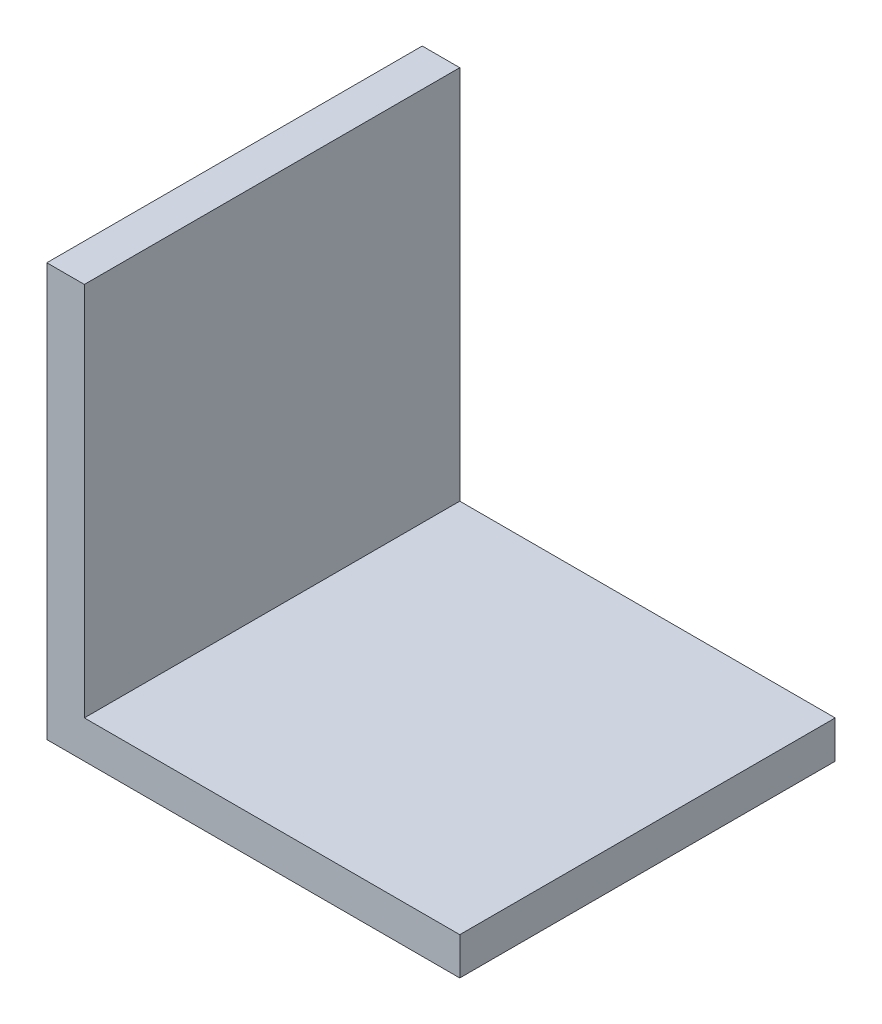
ISO-10303-21;
HEADER;
FILE_DESCRIPTION(('STEP AP214'),'2;1');
FILE_NAME('part.step','',(''),(''),'','','');
FILE_SCHEMA(('AUTOMOTIVE_DESIGN { 1 0 10303 214 1 1 1 1 }'));
ENDSEC;
DATA;
#1=APPLICATION_CONTEXT('core data for automotive mechanical design processes');
#2=APPLICATION_PROTOCOL_DEFINITION('international standard','automotive_design',2000,#1);
#3=PRODUCT_CONTEXT('',#1,'mechanical');
#4=PRODUCT('Part','Part','',(#3));
#5=PRODUCT_RELATED_PRODUCT_CATEGORY('part','',(#4));
#6=PRODUCT_DEFINITION_FORMATION('','',#4);
#7=PRODUCT_DEFINITION_CONTEXT('part definition',#1,'design');
#8=PRODUCT_DEFINITION('design','',#6,#7);
#9=PRODUCT_DEFINITION_SHAPE('','',#8);
#10=(LENGTH_UNIT() NAMED_UNIT(*) SI_UNIT(.MILLI.,.METRE.));
#11=(NAMED_UNIT(*) PLANE_ANGLE_UNIT() SI_UNIT($,.RADIAN.));
#12=(NAMED_UNIT(*) SI_UNIT($,.STERADIAN.) SOLID_ANGLE_UNIT());
#13=UNCERTAINTY_MEASURE_WITH_UNIT(LENGTH_MEASURE(1.E-05),#10,'distance_accuracy_value','');
#14=(GEOMETRIC_REPRESENTATION_CONTEXT(3) GLOBAL_UNCERTAINTY_ASSIGNED_CONTEXT((#13)) GLOBAL_UNIT_ASSIGNED_CONTEXT((#10,
#11,#12)) REPRESENTATION_CONTEXT('',''));
#15=CARTESIAN_POINT('',(0.,0.,0.));
#16=DIRECTION('',(0.,0.,1.));
#17=DIRECTION('',(1.,0.,0.));
#18=AXIS2_PLACEMENT_3D('',#15,#16,#17);
#19=CARTESIAN_POINT('',(0.,-3.,-30.));
#20=DIRECTION('',(0.,-1.,0.));
#21=DIRECTION('',(0.,0.,-1.));
#22=AXIS2_PLACEMENT_3D('',#19,#20,#21);
#23=PLANE('',#22);
#24=DIRECTION('',(1.,0.,0.));
#25=VECTOR('',#24,1.);
#26=CARTESIAN_POINT('',(0.,-3.,0.));
#27=LINE('',#26,#25);
#28=CARTESIAN_POINT('',(-3.,-3.,0.));
#29=VERTEX_POINT('',#28);
#30=CARTESIAN_POINT('',(30.,-3.,0.));
#31=VERTEX_POINT('',#30);
#32=EDGE_CURVE('E115',#29,#31,#27,.T.);
#33=ORIENTED_EDGE('',*,*,#32,.F.);
#34=DIRECTION('',(0.,0.,1.));
#35=VECTOR('',#34,1.);
#36=CARTESIAN_POINT('',(-3.,-3.,-30.));
#37=LINE('',#36,#35);
#38=CARTESIAN_POINT('',(-3.,-3.,-30.));
#39=VERTEX_POINT('',#38);
#40=EDGE_CURVE('E11',#39,#29,#37,.T.);
#41=ORIENTED_EDGE('',*,*,#40,.F.);
#42=DIRECTION('',(1.,0.,0.));
#43=VECTOR('',#42,1.);
#44=CARTESIAN_POINT('',(0.,-3.,-30.));
#45=LINE('',#44,#43);
#46=CARTESIAN_POINT('',(30.,-3.,-30.));
#47=VERTEX_POINT('',#46);
#48=EDGE_CURVE('E128',#39,#47,#45,.T.);
#49=ORIENTED_EDGE('',*,*,#48,.T.);
#50=DIRECTION('',(0.,0.,1.));
#51=VECTOR('',#50,1.);
#52=CARTESIAN_POINT('',(30.,-3.,-30.));
#53=LINE('',#52,#51);
#54=EDGE_CURVE('E36',#47,#31,#53,.T.);
#55=ORIENTED_EDGE('',*,*,#54,.T.);
#56=EDGE_LOOP('',(#33,#41,#49,#55));
#57=FACE_BOUND('',#56,.T.);
#58=ADVANCED_FACE('F33',(#57),#23,.T.);
#59=CARTESIAN_POINT('',(-3.,30.,-30.));
#60=DIRECTION('',(-1.,0.,0.));
#61=DIRECTION('',(0.,-1.,0.));
#62=AXIS2_PLACEMENT_3D('',#59,#60,#61);
#63=PLANE('',#62);
#64=DIRECTION('',(0.,-1.,0.));
#65=VECTOR('',#64,1.);
#66=CARTESIAN_POINT('',(-3.,30.,0.));
#67=LINE('',#66,#65);
#68=CARTESIAN_POINT('',(-3.,30.,0.));
#69=VERTEX_POINT('',#68);
#70=EDGE_CURVE('E126',#69,#29,#67,.T.);
#71=ORIENTED_EDGE('',*,*,#70,.F.);
#72=DIRECTION('',(0.,0.,1.));
#73=VECTOR('',#72,1.);
#74=CARTESIAN_POINT('',(-3.,30.,-30.));
#75=LINE('',#74,#73);
#76=CARTESIAN_POINT('',(-3.,30.,-30.));
#77=VERTEX_POINT('',#76);
#78=EDGE_CURVE('E42',#77,#69,#75,.T.);
#79=ORIENTED_EDGE('',*,*,#78,.F.);
#80=DIRECTION('',(0.,-1.,0.));
#81=VECTOR('',#80,1.);
#82=CARTESIAN_POINT('',(-3.,30.,-30.));
#83=LINE('',#82,#81);
#84=EDGE_CURVE('E96',#77,#39,#83,.T.);
#85=ORIENTED_EDGE('',*,*,#84,.T.);
#86=ORIENTED_EDGE('',*,*,#40,.T.);
#87=EDGE_LOOP('',(#71,#79,#85,#86));
#88=FACE_BOUND('',#87,.T.);
#89=ADVANCED_FACE('F140',(#88),#63,.T.);
#90=CARTESIAN_POINT('',(-3.,30.,-30.));
#91=DIRECTION('',(0.,-1.,0.));
#92=DIRECTION('',(0.,0.,-1.));
#93=AXIS2_PLACEMENT_3D('',#90,#91,#92);
#94=PLANE('',#93);
#95=DIRECTION('',(1.,0.,0.));
#96=VECTOR('',#95,1.);
#97=CARTESIAN_POINT('',(-3.,30.,0.));
#98=LINE('',#97,#96);
#99=CARTESIAN_POINT('',(0.,30.,0.));
#100=VERTEX_POINT('',#99);
#101=EDGE_CURVE('E101',#69,#100,#98,.T.);
#102=ORIENTED_EDGE('',*,*,#101,.T.);
#103=DIRECTION('',(0.,0.,1.));
#104=VECTOR('',#103,1.);
#105=CARTESIAN_POINT('',(0.,30.,-30.));
#106=LINE('',#105,#104);
#107=CARTESIAN_POINT('',(0.,30.,-30.));
#108=VERTEX_POINT('',#107);
#109=EDGE_CURVE('E99',#108,#100,#106,.T.);
#110=ORIENTED_EDGE('',*,*,#109,.F.);
#111=DIRECTION('',(1.,0.,0.));
#112=VECTOR('',#111,1.);
#113=CARTESIAN_POINT('',(-3.,30.,-30.));
#114=LINE('',#113,#112);
#115=EDGE_CURVE('E90',#77,#108,#114,.T.);
#116=ORIENTED_EDGE('',*,*,#115,.F.);
#117=ORIENTED_EDGE('',*,*,#78,.T.);
#118=EDGE_LOOP('',(#102,#110,#116,#117));
#119=FACE_BOUND('',#118,.T.);
#120=ADVANCED_FACE('F100',(#119),#94,.F.);
#121=CARTESIAN_POINT('',(0.,30.,-30.));
#122=DIRECTION('',(-1.,0.,0.));
#123=DIRECTION('',(0.,-1.,0.));
#124=AXIS2_PLACEMENT_3D('',#121,#122,#123);
#125=PLANE('',#124);
#126=DIRECTION('',(0.,-1.,0.));
#127=VECTOR('',#126,1.);
#128=CARTESIAN_POINT('',(0.,30.,0.));
#129=LINE('',#128,#127);
#130=CARTESIAN_POINT('',(0.,0.,0.));
#131=VERTEX_POINT('',#130);
#132=EDGE_CURVE('E123',#100,#131,#129,.T.);
#133=ORIENTED_EDGE('',*,*,#132,.T.);
#134=DIRECTION('',(0.,0.,1.));
#135=VECTOR('',#134,1.);
#136=CARTESIAN_POINT('',(0.,0.,-30.));
#137=LINE('',#136,#135);
#138=CARTESIAN_POINT('',(0.,0.,-30.));
#139=VERTEX_POINT('',#138);
#140=EDGE_CURVE('E104',#139,#131,#137,.T.);
#141=ORIENTED_EDGE('',*,*,#140,.F.);
#142=DIRECTION('',(0.,-1.,0.));
#143=VECTOR('',#142,1.);
#144=CARTESIAN_POINT('',(0.,30.,-30.));
#145=LINE('',#144,#143);
#146=EDGE_CURVE('E94',#108,#139,#145,.T.);
#147=ORIENTED_EDGE('',*,*,#146,.F.);
#148=ORIENTED_EDGE('',*,*,#109,.T.);
#149=EDGE_LOOP('',(#133,#141,#147,#148));
#150=FACE_BOUND('',#149,.T.);
#151=ADVANCED_FACE('F106',(#150),#125,.F.);
#152=CARTESIAN_POINT('',(0.,0.,-30.));
#153=DIRECTION('',(0.,-1.,0.));
#154=DIRECTION('',(0.,0.,-1.));
#155=AXIS2_PLACEMENT_3D('',#152,#153,#154);
#156=PLANE('',#155);
#157=DIRECTION('',(1.,0.,0.));
#158=VECTOR('',#157,1.);
#159=CARTESIAN_POINT('',(0.,0.,0.));
#160=LINE('',#159,#158);
#161=CARTESIAN_POINT('',(30.,0.,0.));
#162=VERTEX_POINT('',#161);
#163=EDGE_CURVE('E121',#131,#162,#160,.T.);
#164=ORIENTED_EDGE('',*,*,#163,.T.);
#165=DIRECTION('',(0.,0.,1.));
#166=VECTOR('',#165,1.);
#167=CARTESIAN_POINT('',(30.,0.,-30.));
#168=LINE('',#167,#166);
#169=CARTESIAN_POINT('',(30.,0.,-30.));
#170=VERTEX_POINT('',#169);
#171=EDGE_CURVE('E131',#170,#162,#168,.T.);
#172=ORIENTED_EDGE('',*,*,#171,.F.);
#173=DIRECTION('',(1.,0.,0.));
#174=VECTOR('',#173,1.);
#175=CARTESIAN_POINT('',(0.,0.,-30.));
#176=LINE('',#175,#174);
#177=EDGE_CURVE('E109',#139,#170,#176,.T.);
#178=ORIENTED_EDGE('',*,*,#177,.F.);
#179=ORIENTED_EDGE('',*,*,#140,.T.);
#180=EDGE_LOOP('',(#164,#172,#178,#179));
#181=FACE_BOUND('',#180,.T.);
#182=ADVANCED_FACE('F153',(#181),#156,.F.);
#183=CARTESIAN_POINT('',(30.,0.,-30.));
#184=DIRECTION('',(-1.,0.,0.));
#185=DIRECTION('',(0.,0.,1.));
#186=AXIS2_PLACEMENT_3D('',#183,#184,#185);
#187=PLANE('',#186);
#188=DIRECTION('',(0.,-1.,0.));
#189=VECTOR('',#188,1.);
#190=CARTESIAN_POINT('',(30.,0.,0.));
#191=LINE('',#190,#189);
#192=EDGE_CURVE('E118',#162,#31,#191,.T.);
#193=ORIENTED_EDGE('',*,*,#192,.T.);
#194=ORIENTED_EDGE('',*,*,#54,.F.);
#195=DIRECTION('',(0.,-1.,0.));
#196=VECTOR('',#195,1.);
#197=CARTESIAN_POINT('',(30.,0.,-30.));
#198=LINE('',#197,#196);
#199=EDGE_CURVE('E82',#170,#47,#198,.T.);
#200=ORIENTED_EDGE('',*,*,#199,.F.);
#201=ORIENTED_EDGE('',*,*,#171,.T.);
#202=EDGE_LOOP('',(#193,#194,#200,#201));
#203=FACE_BOUND('',#202,.T.);
#204=ADVANCED_FACE('F136',(#203),#187,.F.);
#205=CARTESIAN_POINT('',(0.,0.,-30.));
#206=DIRECTION('',(0.,0.,-1.));
#207=DIRECTION('',(-1.,0.,0.));
#208=AXIS2_PLACEMENT_3D('',#205,#206,#207);
#209=PLANE('',#208);
#210=ORIENTED_EDGE('',*,*,#48,.F.);
#211=ORIENTED_EDGE('',*,*,#84,.F.);
#212=ORIENTED_EDGE('',*,*,#115,.T.);
#213=ORIENTED_EDGE('',*,*,#146,.T.);
#214=ORIENTED_EDGE('',*,*,#177,.T.);
#215=ORIENTED_EDGE('',*,*,#199,.T.);
#216=EDGE_LOOP('',(#210,#211,#212,#213,#214,#215));
#217=FACE_BOUND('',#216,.T.);
#218=ADVANCED_FACE('F92',(#217),#209,.T.);
#219=CARTESIAN_POINT('',(0.,0.,0.));
#220=DIRECTION('',(0.,0.,-1.));
#221=DIRECTION('',(-1.,0.,0.));
#222=AXIS2_PLACEMENT_3D('',#219,#220,#221);
#223=PLANE('',#222);
#224=ORIENTED_EDGE('',*,*,#32,.T.);
#225=ORIENTED_EDGE('',*,*,#192,.F.);
#226=ORIENTED_EDGE('',*,*,#163,.F.);
#227=ORIENTED_EDGE('',*,*,#132,.F.);
#228=ORIENTED_EDGE('',*,*,#101,.F.);
#229=ORIENTED_EDGE('',*,*,#70,.T.);
#230=EDGE_LOOP('',(#224,#225,#226,#227,#228,#229));
#231=FACE_BOUND('',#230,.T.);
#232=ADVANCED_FACE('F139',(#231),#223,.F.);
#233=CLOSED_SHELL('',(#58,#89,#120,#151,#182,#204,#218,#232));
#234=MANIFOLD_SOLID_BREP('B2',#233);
#235=ADVANCED_BREP_SHAPE_REPRESENTATION('',(#18,#234),#14);
#236=SHAPE_DEFINITION_REPRESENTATION(#9,#235);
ENDSEC;
END-ISO-10303-21;
